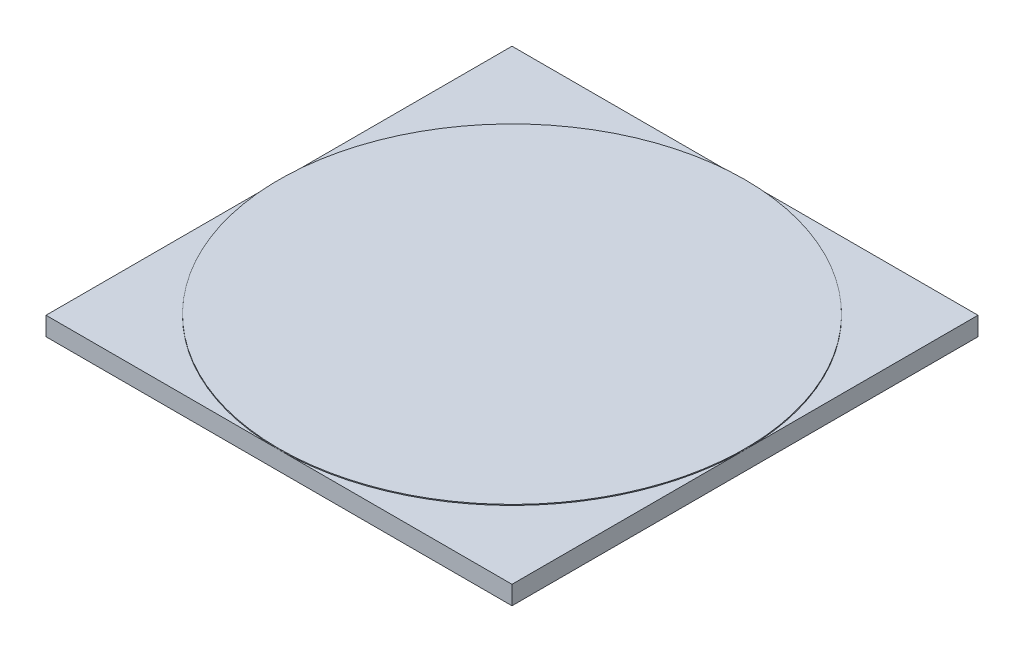
ISO-10303-21;
HEADER;
FILE_DESCRIPTION(('STEP AP214'),'2;1');
FILE_NAME('part.step','',(''),(''),'','','');
FILE_SCHEMA(('AUTOMOTIVE_DESIGN { 1 0 10303 214 1 1 1 1 }'));
ENDSEC;
DATA;
#1=APPLICATION_CONTEXT('core data for automotive mechanical design processes');
#2=APPLICATION_PROTOCOL_DEFINITION('international standard','automotive_design',2000,#1);
#3=PRODUCT_CONTEXT('',#1,'mechanical');
#4=PRODUCT('Part','Part','',(#3));
#5=PRODUCT_RELATED_PRODUCT_CATEGORY('part','',(#4));
#6=PRODUCT_DEFINITION_FORMATION('','',#4);
#7=PRODUCT_DEFINITION_CONTEXT('part definition',#1,'design');
#8=PRODUCT_DEFINITION('design','',#6,#7);
#9=PRODUCT_DEFINITION_SHAPE('','',#8);
#10=(LENGTH_UNIT() NAMED_UNIT(*) SI_UNIT(.MILLI.,.METRE.));
#11=(NAMED_UNIT(*) PLANE_ANGLE_UNIT() SI_UNIT($,.RADIAN.));
#12=(NAMED_UNIT(*) SI_UNIT($,.STERADIAN.) SOLID_ANGLE_UNIT());
#13=UNCERTAINTY_MEASURE_WITH_UNIT(LENGTH_MEASURE(1.E-05),#10,'distance_accuracy_value','');
#14=(GEOMETRIC_REPRESENTATION_CONTEXT(3) GLOBAL_UNCERTAINTY_ASSIGNED_CONTEXT((#13)) GLOBAL_UNIT_ASSIGNED_CONTEXT((#10,
#11,#12)) REPRESENTATION_CONTEXT('',''));
#15=CARTESIAN_POINT('',(0.,0.,0.));
#16=DIRECTION('',(0.,0.,1.));
#17=DIRECTION('',(1.,0.,0.));
#18=AXIS2_PLACEMENT_3D('',#15,#16,#17);
#19=CARTESIAN_POINT('',(0.,2.,0.));
#20=DIRECTION('',(0.,-1.,0.));
#21=DIRECTION('',(0.,0.,-1.));
#22=AXIS2_PLACEMENT_3D('',#19,#20,#21);
#23=PLANE('',#22);
#24=CARTESIAN_POINT('',(25.,2.,-25.));
#25=DIRECTION('',(0.,1.,0.));
#26=DIRECTION('',(0.,0.,1.));
#27=AXIS2_PLACEMENT_3D('',#24,#25,#26);
#28=CIRCLE('',#27,25.);
#29=CARTESIAN_POINT('',(25.,2.,0.));
#30=VERTEX_POINT('',#29);
#31=CARTESIAN_POINT('',(50.,2.,-25.));
#32=VERTEX_POINT('',#31);
#33=EDGE_CURVE('E51',#30,#32,#28,.T.);
#34=ORIENTED_EDGE('',*,*,#33,.F.);
#35=DIRECTION('',(1.,0.,0.));
#36=VECTOR('',#35,1.);
#37=CARTESIAN_POINT('',(0.,2.,0.));
#38=LINE('',#37,#36);
#39=CARTESIAN_POINT('',(50.,2.,0.));
#40=VERTEX_POINT('',#39);
#41=EDGE_CURVE('E106',#30,#40,#38,.T.);
#42=ORIENTED_EDGE('',*,*,#41,.T.);
#43=DIRECTION('',(0.,0.,-1.));
#44=VECTOR('',#43,1.);
#45=CARTESIAN_POINT('',(50.,2.,0.));
#46=LINE('',#45,#44);
#47=EDGE_CURVE('E119',#40,#32,#46,.T.);
#48=ORIENTED_EDGE('',*,*,#47,.T.);
#49=EDGE_LOOP('',(#34,#42,#48));
#50=FACE_BOUND('',#49,.T.);
#51=ADVANCED_FACE('F39',(#50),#23,.F.);
#52=CARTESIAN_POINT('',(25.,2.,-50.));
#53=VERTEX_POINT('',#52);
#54=EDGE_CURVE('E11',#32,#53,#28,.T.);
#55=ORIENTED_EDGE('',*,*,#54,.F.);
#56=CARTESIAN_POINT('',(50.,2.,-50.));
#57=VERTEX_POINT('',#56);
#58=EDGE_CURVE('E105',#32,#57,#46,.T.);
#59=ORIENTED_EDGE('',*,*,#58,.T.);
#60=DIRECTION('',(-1.,0.,0.));
#61=VECTOR('',#60,1.);
#62=CARTESIAN_POINT('',(0.,2.,-50.));
#63=LINE('',#62,#61);
#64=EDGE_CURVE('E134',#57,#53,#63,.T.);
#65=ORIENTED_EDGE('',*,*,#64,.T.);
#66=EDGE_LOOP('',(#55,#59,#65));
#67=FACE_BOUND('',#66,.T.);
#68=ADVANCED_FACE('F192',(#67),#23,.F.);
#69=CARTESIAN_POINT('',(0.,2.,-25.));
#70=VERTEX_POINT('',#69);
#71=EDGE_CURVE('E49',#53,#70,#28,.T.);
#72=ORIENTED_EDGE('',*,*,#71,.F.);
#73=CARTESIAN_POINT('',(0.,2.,-50.));
#74=VERTEX_POINT('',#73);
#75=EDGE_CURVE('E133',#53,#74,#63,.T.);
#76=ORIENTED_EDGE('',*,*,#75,.T.);
#77=DIRECTION('',(0.,0.,1.));
#78=VECTOR('',#77,1.);
#79=CARTESIAN_POINT('',(0.,2.,0.));
#80=LINE('',#79,#78);
#81=EDGE_CURVE('E117',#74,#70,#80,.T.);
#82=ORIENTED_EDGE('',*,*,#81,.T.);
#83=EDGE_LOOP('',(#72,#76,#82));
#84=FACE_BOUND('',#83,.T.);
#85=ADVANCED_FACE('F172',(#84),#23,.F.);
#86=CARTESIAN_POINT('',(0.,2.,0.));
#87=DIRECTION('',(1.,0.,0.));
#88=DIRECTION('',(0.,0.,-1.));
#89=AXIS2_PLACEMENT_3D('',#86,#87,#88);
#90=PLANE('',#89);
#91=DIRECTION('',(0.,0.,1.));
#92=VECTOR('',#91,1.);
#93=CARTESIAN_POINT('',(0.,0.,0.));
#94=LINE('',#93,#92);
#95=CARTESIAN_POINT('',(0.,0.,-50.));
#96=VERTEX_POINT('',#95);
#97=CARTESIAN_POINT('',(0.,0.,0.));
#98=VERTEX_POINT('',#97);
#99=EDGE_CURVE('E138',#96,#98,#94,.T.);
#100=ORIENTED_EDGE('',*,*,#99,.T.);
#101=DIRECTION('',(0.,-1.,0.));
#102=VECTOR('',#101,1.);
#103=CARTESIAN_POINT('',(0.,2.,0.));
#104=LINE('',#103,#102);
#105=CARTESIAN_POINT('',(0.,2.,0.));
#106=VERTEX_POINT('',#105);
#107=EDGE_CURVE('E43',#106,#98,#104,.T.);
#108=ORIENTED_EDGE('',*,*,#107,.F.);
#109=EDGE_CURVE('E100',#70,#106,#80,.T.);
#110=ORIENTED_EDGE('',*,*,#109,.F.);
#111=ORIENTED_EDGE('',*,*,#81,.F.);
#112=DIRECTION('',(0.,-1.,0.));
#113=VECTOR('',#112,1.);
#114=CARTESIAN_POINT('',(0.,2.,-50.));
#115=LINE('',#114,#113);
#116=EDGE_CURVE('E137',#74,#96,#115,.T.);
#117=ORIENTED_EDGE('',*,*,#116,.T.);
#118=EDGE_LOOP('',(#100,#108,#110,#111,#117));
#119=FACE_BOUND('',#118,.T.);
#120=ADVANCED_FACE('F41',(#119),#90,.F.);
#121=CARTESIAN_POINT('',(0.,2.,0.));
#122=DIRECTION('',(0.,0.,-1.));
#123=DIRECTION('',(-1.,0.,0.));
#124=AXIS2_PLACEMENT_3D('',#121,#122,#123);
#125=PLANE('',#124);
#126=DIRECTION('',(1.,0.,0.));
#127=VECTOR('',#126,1.);
#128=CARTESIAN_POINT('',(0.,0.,0.));
#129=LINE('',#128,#127);
#130=CARTESIAN_POINT('',(50.,0.,0.));
#131=VERTEX_POINT('',#130);
#132=EDGE_CURVE('E142',#98,#131,#129,.T.);
#133=ORIENTED_EDGE('',*,*,#132,.T.);
#134=DIRECTION('',(0.,-1.,0.));
#135=VECTOR('',#134,1.);
#136=CARTESIAN_POINT('',(50.,2.,0.));
#137=LINE('',#136,#135);
#138=EDGE_CURVE('E112',#40,#131,#137,.T.);
#139=ORIENTED_EDGE('',*,*,#138,.F.);
#140=ORIENTED_EDGE('',*,*,#41,.F.);
#141=EDGE_CURVE('E94',#106,#30,#38,.T.);
#142=ORIENTED_EDGE('',*,*,#141,.F.);
#143=ORIENTED_EDGE('',*,*,#107,.T.);
#144=EDGE_LOOP('',(#133,#139,#140,#142,#143));
#145=FACE_BOUND('',#144,.T.);
#146=ADVANCED_FACE('F110',(#145),#125,.F.);
#147=CARTESIAN_POINT('',(50.,2.,0.));
#148=DIRECTION('',(-1.,0.,0.));
#149=DIRECTION('',(0.,0.,1.));
#150=AXIS2_PLACEMENT_3D('',#147,#148,#149);
#151=PLANE('',#150);
#152=DIRECTION('',(0.,0.,-1.));
#153=VECTOR('',#152,1.);
#154=CARTESIAN_POINT('',(50.,0.,0.));
#155=LINE('',#154,#153);
#156=CARTESIAN_POINT('',(50.,0.,-50.));
#157=VERTEX_POINT('',#156);
#158=EDGE_CURVE('E145',#131,#157,#155,.T.);
#159=ORIENTED_EDGE('',*,*,#158,.T.);
#160=DIRECTION('',(0.,-1.,0.));
#161=VECTOR('',#160,1.);
#162=CARTESIAN_POINT('',(50.,2.,-50.));
#163=LINE('',#162,#161);
#164=EDGE_CURVE('E154',#57,#157,#163,.T.);
#165=ORIENTED_EDGE('',*,*,#164,.F.);
#166=ORIENTED_EDGE('',*,*,#58,.F.);
#167=ORIENTED_EDGE('',*,*,#47,.F.);
#168=ORIENTED_EDGE('',*,*,#138,.T.);
#169=EDGE_LOOP('',(#159,#165,#166,#167,#168));
#170=FACE_BOUND('',#169,.T.);
#171=ADVANCED_FACE('F160',(#170),#151,.F.);
#172=CARTESIAN_POINT('',(0.,2.,-50.));
#173=DIRECTION('',(0.,0.,1.));
#174=DIRECTION('',(1.,0.,0.));
#175=AXIS2_PLACEMENT_3D('',#172,#173,#174);
#176=PLANE('',#175);
#177=DIRECTION('',(-1.,0.,0.));
#178=VECTOR('',#177,1.);
#179=CARTESIAN_POINT('',(0.,0.,-50.));
#180=LINE('',#179,#178);
#181=EDGE_CURVE('E148',#157,#96,#180,.T.);
#182=ORIENTED_EDGE('',*,*,#181,.T.);
#183=ORIENTED_EDGE('',*,*,#116,.F.);
#184=ORIENTED_EDGE('',*,*,#75,.F.);
#185=ORIENTED_EDGE('',*,*,#64,.F.);
#186=ORIENTED_EDGE('',*,*,#164,.T.);
#187=EDGE_LOOP('',(#182,#183,#184,#185,#186));
#188=FACE_BOUND('',#187,.T.);
#189=ADVANCED_FACE('F168',(#188),#176,.F.);
#190=EDGE_CURVE('E98',#70,#30,#28,.T.);
#191=ORIENTED_EDGE('',*,*,#190,.F.);
#192=ORIENTED_EDGE('',*,*,#109,.T.);
#193=ORIENTED_EDGE('',*,*,#141,.T.);
#194=EDGE_LOOP('',(#191,#192,#193));
#195=FACE_BOUND('',#194,.T.);
#196=ADVANCED_FACE('F96',(#195),#23,.F.);
#197=CARTESIAN_POINT('',(0.,0.,0.));
#198=DIRECTION('',(0.,-1.,0.));
#199=DIRECTION('',(0.,0.,-1.));
#200=AXIS2_PLACEMENT_3D('',#197,#198,#199);
#201=PLANE('',#200);
#202=ORIENTED_EDGE('',*,*,#99,.F.);
#203=ORIENTED_EDGE('',*,*,#181,.F.);
#204=ORIENTED_EDGE('',*,*,#158,.F.);
#205=ORIENTED_EDGE('',*,*,#132,.F.);
#206=EDGE_LOOP('',(#202,#203,#204,#205));
#207=FACE_BOUND('',#206,.T.);
#208=ADVANCED_FACE('F165',(#207),#201,.T.);
#209=CARTESIAN_POINT('',(25.,2.1,-25.));
#210=DIRECTION('',(0.,-1.,0.));
#211=DIRECTION('',(0.,0.,-1.));
#212=AXIS2_PLACEMENT_3D('',#209,#210,#211);
#213=CYLINDRICAL_SURFACE('',#212,25.);
#214=CARTESIAN_POINT('',(25.,2.1,-25.));
#215=DIRECTION('',(0.,1.,0.));
#216=DIRECTION('',(0.,0.,1.));
#217=AXIS2_PLACEMENT_3D('',#214,#215,#216);
#218=CIRCLE('',#217,25.);
#219=CARTESIAN_POINT('',(25.,2.1,0.));
#220=VERTEX_POINT('',#219);
#221=EDGE_CURVE('E122',#220,#220,#218,.T.);
#222=ORIENTED_EDGE('',*,*,#221,.F.);
#223=EDGE_LOOP('',(#222));
#224=FACE_BOUND('',#223,.T.);
#225=ORIENTED_EDGE('',*,*,#33,.T.);
#226=ORIENTED_EDGE('',*,*,#54,.T.);
#227=ORIENTED_EDGE('',*,*,#71,.T.);
#228=ORIENTED_EDGE('',*,*,#190,.T.);
#229=EDGE_LOOP('',(#225,#226,#227,#228));
#230=FACE_BOUND('',#229,.T.);
#231=ADVANCED_FACE('F123',(#224,#230),#213,.T.);
#232=CARTESIAN_POINT('',(25.,2.1,-25.));
#233=DIRECTION('',(0.,1.,0.));
#234=DIRECTION('',(0.,0.,1.));
#235=AXIS2_PLACEMENT_3D('',#232,#233,#234);
#236=PLANE('',#235);
#237=ORIENTED_EDGE('',*,*,#221,.T.);
#238=EDGE_LOOP('',(#237));
#239=FACE_BOUND('',#238,.T.);
#240=ADVANCED_FACE('F180',(#239),#236,.T.);
#241=CLOSED_SHELL('',(#51,#68,#85,#120,#146,#171,#189,#196,#208,#231,#240));
#242=MANIFOLD_SOLID_BREP('B2',#241);
#243=ADVANCED_BREP_SHAPE_REPRESENTATION('',(#18,#242),#14);
#244=SHAPE_DEFINITION_REPRESENTATION(#9,#243);
ENDSEC;
END-ISO-10303-21;
